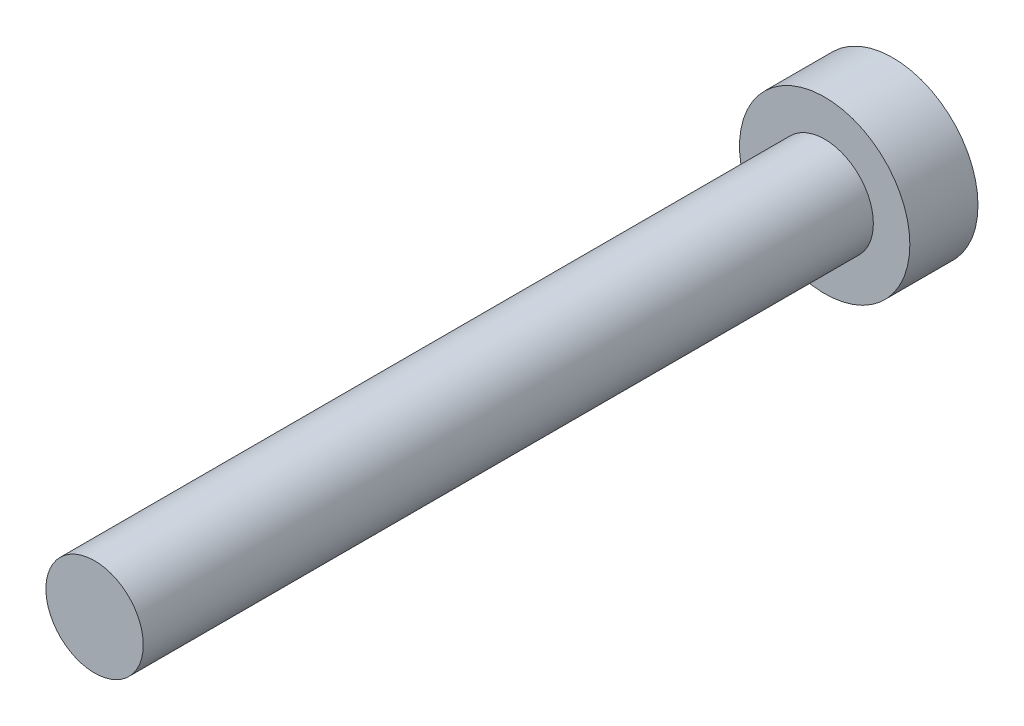
ISO-10303-21;
HEADER;
FILE_DESCRIPTION(('STEP AP214'),'2;1');
FILE_NAME('part.step','',(''),(''),'','','');
FILE_SCHEMA(('AUTOMOTIVE_DESIGN { 1 0 10303 214 1 1 1 1 }'));
ENDSEC;
DATA;
#1=APPLICATION_CONTEXT('core data for automotive mechanical design processes');
#2=APPLICATION_PROTOCOL_DEFINITION('international standard','automotive_design',2000,#1);
#3=PRODUCT_CONTEXT('',#1,'mechanical');
#4=PRODUCT('Part','Part','',(#3));
#5=PRODUCT_RELATED_PRODUCT_CATEGORY('part','',(#4));
#6=PRODUCT_DEFINITION_FORMATION('','',#4);
#7=PRODUCT_DEFINITION_CONTEXT('part definition',#1,'design');
#8=PRODUCT_DEFINITION('design','',#6,#7);
#9=PRODUCT_DEFINITION_SHAPE('','',#8);
#10=(LENGTH_UNIT() NAMED_UNIT(*) SI_UNIT(.MILLI.,.METRE.));
#11=(NAMED_UNIT(*) PLANE_ANGLE_UNIT() SI_UNIT($,.RADIAN.));
#12=(NAMED_UNIT(*) SI_UNIT($,.STERADIAN.) SOLID_ANGLE_UNIT());
#13=UNCERTAINTY_MEASURE_WITH_UNIT(LENGTH_MEASURE(1.E-05),#10,'distance_accuracy_value','');
#14=(GEOMETRIC_REPRESENTATION_CONTEXT(3) GLOBAL_UNCERTAINTY_ASSIGNED_CONTEXT((#13)) GLOBAL_UNIT_ASSIGNED_CONTEXT((#10,
#11,#12)) REPRESENTATION_CONTEXT('',''));
#15=CARTESIAN_POINT('',(0.,0.,0.));
#16=DIRECTION('',(0.,0.,1.));
#17=DIRECTION('',(1.,0.,0.));
#18=AXIS2_PLACEMENT_3D('',#15,#16,#17);
#19=CARTESIAN_POINT('',(0.,0.,-2.8));
#20=DIRECTION('',(0.,0.,1.));
#21=DIRECTION('',(1.,0.,0.));
#22=AXIS2_PLACEMENT_3D('',#19,#20,#21);
#23=PLANE('',#22);
#24=CARTESIAN_POINT('',(0.,0.,-2.8));
#25=DIRECTION('',(0.,0.,1.));
#26=DIRECTION('',(1.,0.,0.));
#27=AXIS2_PLACEMENT_3D('',#24,#25,#26);
#28=CIRCLE('',#27,3.5);
#29=CARTESIAN_POINT('',(3.5,0.,-2.8));
#30=VERTEX_POINT('',#29);
#31=EDGE_CURVE('E112',#30,#30,#28,.T.);
#32=ORIENTED_EDGE('',*,*,#31,.F.);
#33=EDGE_LOOP('',(#32));
#34=FACE_BOUND('',#33,.T.);
#35=DIRECTION('',(-0.5,-0.866025403784439,0.));
#36=VECTOR('',#35,1.);
#37=CARTESIAN_POINT('',(1.08253175473055,-0.625,-2.8));
#38=LINE('',#37,#36);
#39=CARTESIAN_POINT('',(1.44337567297406,0.,-2.8));
#40=VERTEX_POINT('',#39);
#41=CARTESIAN_POINT('',(0.721687836487032,-1.25,-2.8));
#42=VERTEX_POINT('',#41);
#43=EDGE_CURVE('E11',#40,#42,#38,.T.);
#44=ORIENTED_EDGE('',*,*,#43,.F.);
#45=DIRECTION('',(0.5,-0.866025403784439,0.));
#46=VECTOR('',#45,1.);
#47=CARTESIAN_POINT('',(1.08253175473055,0.625,-2.8));
#48=LINE('',#47,#46);
#49=CARTESIAN_POINT('',(0.721687836487032,1.25,-2.8));
#50=VERTEX_POINT('',#49);
#51=EDGE_CURVE('E50',#50,#40,#48,.T.);
#52=ORIENTED_EDGE('',*,*,#51,.F.);
#53=DIRECTION('',(1.,0.,0.));
#54=VECTOR('',#53,1.);
#55=CARTESIAN_POINT('',(0.,1.25,-2.8));
#56=LINE('',#55,#54);
#57=CARTESIAN_POINT('',(-0.721687836487032,1.25,-2.8));
#58=VERTEX_POINT('',#57);
#59=EDGE_CURVE('E133',#58,#50,#56,.T.);
#60=ORIENTED_EDGE('',*,*,#59,.F.);
#61=DIRECTION('',(0.5,0.866025403784439,0.));
#62=VECTOR('',#61,1.);
#63=CARTESIAN_POINT('',(-1.08253175473055,0.625,-2.8));
#64=LINE('',#63,#62);
#65=CARTESIAN_POINT('',(-1.44337567297406,0.,-2.8));
#66=VERTEX_POINT('',#65);
#67=EDGE_CURVE('E129',#66,#58,#64,.T.);
#68=ORIENTED_EDGE('',*,*,#67,.F.);
#69=DIRECTION('',(-0.5,0.866025403784439,0.));
#70=VECTOR('',#69,1.);
#71=CARTESIAN_POINT('',(-1.08253175473055,-0.624999999999999,-2.8));
#72=LINE('',#71,#70);
#73=CARTESIAN_POINT('',(-0.721687836487033,-1.25,-2.8));
#74=VERTEX_POINT('',#73);
#75=EDGE_CURVE('E130',#74,#66,#72,.T.);
#76=ORIENTED_EDGE('',*,*,#75,.F.);
#77=DIRECTION('',(-1.,0.,0.));
#78=VECTOR('',#77,1.);
#79=CARTESIAN_POINT('',(0.,-1.25,-2.8));
#80=LINE('',#79,#78);
#81=EDGE_CURVE('E116',#42,#74,#80,.T.);
#82=ORIENTED_EDGE('',*,*,#81,.F.);
#83=EDGE_LOOP('',(#44,#52,#60,#68,#76,#82));
#84=FACE_BOUND('',#83,.T.);
#85=ADVANCED_FACE('F39',(#34,#84),#23,.F.);
#86=CARTESIAN_POINT('',(0.,0.,0.));
#87=DIRECTION('',(0.,0.,-1.));
#88=DIRECTION('',(-1.,0.,0.));
#89=AXIS2_PLACEMENT_3D('',#86,#87,#88);
#90=CYLINDRICAL_SURFACE('',#89,3.5);
#91=CARTESIAN_POINT('',(0.,0.,0.));
#92=DIRECTION('',(0.,0.,1.));
#93=DIRECTION('',(1.,0.,0.));
#94=AXIS2_PLACEMENT_3D('',#91,#92,#93);
#95=CIRCLE('',#94,3.5);
#96=CARTESIAN_POINT('',(3.5,0.,0.));
#97=VERTEX_POINT('',#96);
#98=EDGE_CURVE('E121',#97,#97,#95,.T.);
#99=ORIENTED_EDGE('',*,*,#98,.F.);
#100=EDGE_LOOP('',(#99));
#101=FACE_BOUND('',#100,.T.);
#102=ORIENTED_EDGE('',*,*,#31,.T.);
#103=EDGE_LOOP('',(#102));
#104=FACE_BOUND('',#103,.T.);
#105=ADVANCED_FACE('F41',(#101,#104),#90,.T.);
#106=CARTESIAN_POINT('',(0.,0.,0.));
#107=DIRECTION('',(0.,0.,1.));
#108=DIRECTION('',(1.,0.,0.));
#109=AXIS2_PLACEMENT_3D('',#106,#107,#108);
#110=PLANE('',#109);
#111=CARTESIAN_POINT('',(0.,0.,0.));
#112=DIRECTION('',(0.,0.,1.));
#113=DIRECTION('',(1.,0.,0.));
#114=AXIS2_PLACEMENT_3D('',#111,#112,#113);
#115=CIRCLE('',#114,2.);
#116=CARTESIAN_POINT('',(2.,0.,0.));
#117=VERTEX_POINT('',#116);
#118=EDGE_CURVE('E119',#117,#117,#115,.T.);
#119=ORIENTED_EDGE('',*,*,#118,.F.);
#120=EDGE_LOOP('',(#119));
#121=FACE_BOUND('',#120,.T.);
#122=ORIENTED_EDGE('',*,*,#98,.T.);
#123=EDGE_LOOP('',(#122));
#124=FACE_BOUND('',#123,.T.);
#125=ADVANCED_FACE('F177',(#121,#124),#110,.T.);
#126=CARTESIAN_POINT('',(0.,0.,30.));
#127=DIRECTION('',(0.,0.,-1.));
#128=DIRECTION('',(-1.,0.,0.));
#129=AXIS2_PLACEMENT_3D('',#126,#127,#128);
#130=CYLINDRICAL_SURFACE('',#129,2.);
#131=CARTESIAN_POINT('',(0.,0.,30.));
#132=DIRECTION('',(0.,0.,1.));
#133=DIRECTION('',(1.,0.,0.));
#134=AXIS2_PLACEMENT_3D('',#131,#132,#133);
#135=CIRCLE('',#134,2.);
#136=CARTESIAN_POINT('',(2.,0.,30.));
#137=VERTEX_POINT('',#136);
#138=EDGE_CURVE('E110',#137,#137,#135,.T.);
#139=ORIENTED_EDGE('',*,*,#138,.F.);
#140=EDGE_LOOP('',(#139));
#141=FACE_BOUND('',#140,.T.);
#142=ORIENTED_EDGE('',*,*,#118,.T.);
#143=EDGE_LOOP('',(#142));
#144=FACE_BOUND('',#143,.T.);
#145=ADVANCED_FACE('F184',(#141,#144),#130,.T.);
#146=CARTESIAN_POINT('',(0.,0.,30.));
#147=DIRECTION('',(0.,0.,1.));
#148=DIRECTION('',(1.,0.,0.));
#149=AXIS2_PLACEMENT_3D('',#146,#147,#148);
#150=PLANE('',#149);
#151=ORIENTED_EDGE('',*,*,#138,.T.);
#152=EDGE_LOOP('',(#151));
#153=FACE_BOUND('',#152,.T.);
#154=ADVANCED_FACE('F187',(#153),#150,.T.);
#155=CARTESIAN_POINT('',(0.721687836487032,-1.25,-1.25));
#156=DIRECTION('',(-0.866025403784439,0.5,0.));
#157=DIRECTION('',(-0.5,-0.866025403784439,0.));
#158=AXIS2_PLACEMENT_3D('',#155,#156,#157);
#159=PLANE('',#158);
#160=ORIENTED_EDGE('',*,*,#43,.T.);
#161=DIRECTION('',(0.,0.,-1.));
#162=VECTOR('',#161,1.);
#163=CARTESIAN_POINT('',(0.721687836487032,-1.25,-1.25));
#164=LINE('',#163,#162);
#165=CARTESIAN_POINT('',(0.721687836487032,-1.25,-1.25));
#166=VERTEX_POINT('',#165);
#167=EDGE_CURVE('E53',#166,#42,#164,.T.);
#168=ORIENTED_EDGE('',*,*,#167,.F.);
#169=DIRECTION('',(0.5,0.866025403784439,0.));
#170=VECTOR('',#169,1.);
#171=CARTESIAN_POINT('',(0.721687836487032,-1.25,-1.25));
#172=LINE('',#171,#170);
#173=CARTESIAN_POINT('',(1.44337567297406,0.,-1.25));
#174=VERTEX_POINT('',#173);
#175=EDGE_CURVE('E96',#166,#174,#172,.T.);
#176=ORIENTED_EDGE('',*,*,#175,.T.);
#177=DIRECTION('',(0.,0.,-1.));
#178=VECTOR('',#177,1.);
#179=CARTESIAN_POINT('',(1.44337567297406,0.,-1.25));
#180=LINE('',#179,#178);
#181=EDGE_CURVE('E103',#174,#40,#180,.T.);
#182=ORIENTED_EDGE('',*,*,#181,.T.);
#183=EDGE_LOOP('',(#160,#168,#176,#182));
#184=FACE_BOUND('',#183,.T.);
#185=ADVANCED_FACE('F105',(#184),#159,.T.);
#186=CARTESIAN_POINT('',(1.44337567297406,0.,-1.25));
#187=DIRECTION('',(-0.866025403784439,-0.5,0.));
#188=DIRECTION('',(0.5,-0.866025403784439,0.));
#189=AXIS2_PLACEMENT_3D('',#186,#187,#188);
#190=PLANE('',#189);
#191=ORIENTED_EDGE('',*,*,#51,.T.);
#192=ORIENTED_EDGE('',*,*,#181,.F.);
#193=DIRECTION('',(-0.5,0.866025403784439,0.));
#194=VECTOR('',#193,1.);
#195=CARTESIAN_POINT('',(1.44337567297406,0.,-1.25));
#196=LINE('',#195,#194);
#197=CARTESIAN_POINT('',(0.721687836487032,1.25,-1.25));
#198=VERTEX_POINT('',#197);
#199=EDGE_CURVE('E95',#174,#198,#196,.T.);
#200=ORIENTED_EDGE('',*,*,#199,.T.);
#201=DIRECTION('',(0.,0.,-1.));
#202=VECTOR('',#201,1.);
#203=CARTESIAN_POINT('',(0.721687836487032,1.25,-1.25));
#204=LINE('',#203,#202);
#205=EDGE_CURVE('E107',#198,#50,#204,.T.);
#206=ORIENTED_EDGE('',*,*,#205,.T.);
#207=EDGE_LOOP('',(#191,#192,#200,#206));
#208=FACE_BOUND('',#207,.T.);
#209=ADVANCED_FACE('F106',(#208),#190,.T.);
#210=CARTESIAN_POINT('',(0.721687836487032,1.25,-1.25));
#211=DIRECTION('',(0.,-1.,0.));
#212=DIRECTION('',(1.,0.,0.));
#213=AXIS2_PLACEMENT_3D('',#210,#211,#212);
#214=PLANE('',#213);
#215=ORIENTED_EDGE('',*,*,#59,.T.);
#216=ORIENTED_EDGE('',*,*,#205,.F.);
#217=DIRECTION('',(-1.,0.,0.));
#218=VECTOR('',#217,1.);
#219=CARTESIAN_POINT('',(0.721687836487032,1.25,-1.25));
#220=LINE('',#219,#218);
#221=CARTESIAN_POINT('',(-0.721687836487032,1.25,-1.25));
#222=VERTEX_POINT('',#221);
#223=EDGE_CURVE('E98',#198,#222,#220,.T.);
#224=ORIENTED_EDGE('',*,*,#223,.T.);
#225=DIRECTION('',(0.,0.,-1.));
#226=VECTOR('',#225,1.);
#227=CARTESIAN_POINT('',(-0.721687836487032,1.25,-1.25));
#228=LINE('',#227,#226);
#229=EDGE_CURVE('E114',#222,#58,#228,.T.);
#230=ORIENTED_EDGE('',*,*,#229,.T.);
#231=EDGE_LOOP('',(#215,#216,#224,#230));
#232=FACE_BOUND('',#231,.T.);
#233=ADVANCED_FACE('F131',(#232),#214,.T.);
#234=CARTESIAN_POINT('',(-0.721687836487032,1.25,-1.25));
#235=DIRECTION('',(0.866025403784439,-0.5,0.));
#236=DIRECTION('',(0.5,0.866025403784439,0.));
#237=AXIS2_PLACEMENT_3D('',#234,#235,#236);
#238=PLANE('',#237);
#239=ORIENTED_EDGE('',*,*,#67,.T.);
#240=ORIENTED_EDGE('',*,*,#229,.F.);
#241=DIRECTION('',(-0.5,-0.866025403784439,0.));
#242=VECTOR('',#241,1.);
#243=CARTESIAN_POINT('',(-0.721687836487032,1.25,-1.25));
#244=LINE('',#243,#242);
#245=CARTESIAN_POINT('',(-1.44337567297406,0.,-1.25));
#246=VERTEX_POINT('',#245);
#247=EDGE_CURVE('E157',#222,#246,#244,.T.);
#248=ORIENTED_EDGE('',*,*,#247,.T.);
#249=DIRECTION('',(0.,0.,-1.));
#250=VECTOR('',#249,1.);
#251=CARTESIAN_POINT('',(-1.44337567297406,0.,-1.25));
#252=LINE('',#251,#250);
#253=EDGE_CURVE('E151',#246,#66,#252,.T.);
#254=ORIENTED_EDGE('',*,*,#253,.T.);
#255=EDGE_LOOP('',(#239,#240,#248,#254));
#256=FACE_BOUND('',#255,.T.);
#257=ADVANCED_FACE('F165',(#256),#238,.T.);
#258=CARTESIAN_POINT('',(-1.44337567297406,0.,-1.25));
#259=DIRECTION('',(0.866025403784439,0.5,0.));
#260=DIRECTION('',(-0.5,0.866025403784439,0.));
#261=AXIS2_PLACEMENT_3D('',#258,#259,#260);
#262=PLANE('',#261);
#263=ORIENTED_EDGE('',*,*,#75,.T.);
#264=ORIENTED_EDGE('',*,*,#253,.F.);
#265=DIRECTION('',(0.5,-0.866025403784439,0.));
#266=VECTOR('',#265,1.);
#267=CARTESIAN_POINT('',(-1.44337567297406,0.,-1.25));
#268=LINE('',#267,#266);
#269=CARTESIAN_POINT('',(-0.721687836487033,-1.25,-1.25));
#270=VERTEX_POINT('',#269);
#271=EDGE_CURVE('E147',#246,#270,#268,.T.);
#272=ORIENTED_EDGE('',*,*,#271,.T.);
#273=DIRECTION('',(0.,0.,-1.));
#274=VECTOR('',#273,1.);
#275=CARTESIAN_POINT('',(-0.721687836487033,-1.25,-1.25));
#276=LINE('',#275,#274);
#277=EDGE_CURVE('E145',#270,#74,#276,.T.);
#278=ORIENTED_EDGE('',*,*,#277,.T.);
#279=EDGE_LOOP('',(#263,#264,#272,#278));
#280=FACE_BOUND('',#279,.T.);
#281=ADVANCED_FACE('F148',(#280),#262,.T.);
#282=CARTESIAN_POINT('',(-0.721687836487033,-1.25,-1.25));
#283=DIRECTION('',(0.,1.,0.));
#284=DIRECTION('',(-1.,0.,0.));
#285=AXIS2_PLACEMENT_3D('',#282,#283,#284);
#286=PLANE('',#285);
#287=ORIENTED_EDGE('',*,*,#81,.T.);
#288=ORIENTED_EDGE('',*,*,#277,.F.);
#289=DIRECTION('',(1.,0.,0.));
#290=VECTOR('',#289,1.);
#291=CARTESIAN_POINT('',(-0.721687836487033,-1.25,-1.25));
#292=LINE('',#291,#290);
#293=EDGE_CURVE('E152',#270,#166,#292,.T.);
#294=ORIENTED_EDGE('',*,*,#293,.T.);
#295=ORIENTED_EDGE('',*,*,#167,.T.);
#296=EDGE_LOOP('',(#287,#288,#294,#295));
#297=FACE_BOUND('',#296,.T.);
#298=ADVANCED_FACE('F141',(#297),#286,.T.);
#299=CARTESIAN_POINT('',(0.,0.,-1.25));
#300=DIRECTION('',(0.,0.,1.));
#301=DIRECTION('',(1.,0.,0.));
#302=AXIS2_PLACEMENT_3D('',#299,#300,#301);
#303=PLANE('',#302);
#304=ORIENTED_EDGE('',*,*,#175,.F.);
#305=ORIENTED_EDGE('',*,*,#293,.F.);
#306=ORIENTED_EDGE('',*,*,#271,.F.);
#307=ORIENTED_EDGE('',*,*,#247,.F.);
#308=ORIENTED_EDGE('',*,*,#223,.F.);
#309=ORIENTED_EDGE('',*,*,#199,.F.);
#310=EDGE_LOOP('',(#304,#305,#306,#307,#308,#309));
#311=FACE_BOUND('',#310,.T.);
#312=ADVANCED_FACE('F94',(#311),#303,.F.);
#313=CLOSED_SHELL('',(#85,#105,#125,#145,#154,#185,#209,#233,#257,#281,#298,#312));
#314=MANIFOLD_SOLID_BREP('B2',#313);
#315=ADVANCED_BREP_SHAPE_REPRESENTATION('',(#18,#314),#14);
#316=SHAPE_DEFINITION_REPRESENTATION(#9,#315);
ENDSEC;
END-ISO-10303-21;
